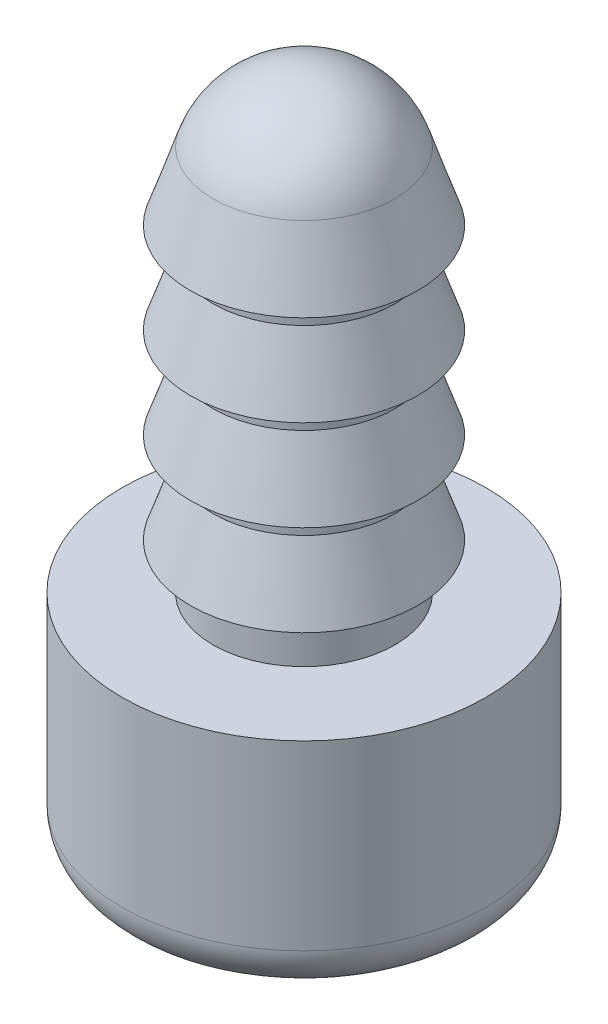
ISO-10303-21;
HEADER;
FILE_DESCRIPTION(('STEP AP214'),'2;1');
FILE_NAME('part.step','',(''),(''),'','','');
FILE_SCHEMA(('AUTOMOTIVE_DESIGN { 1 0 10303 214 1 1 1 1 }'));
ENDSEC;
DATA;
#1=APPLICATION_CONTEXT('core data for automotive mechanical design processes');
#2=APPLICATION_PROTOCOL_DEFINITION('international standard','automotive_design',2000,#1);
#3=PRODUCT_CONTEXT('',#1,'mechanical');
#4=PRODUCT('Part','Part','',(#3));
#5=PRODUCT_RELATED_PRODUCT_CATEGORY('part','',(#4));
#6=PRODUCT_DEFINITION_FORMATION('','',#4);
#7=PRODUCT_DEFINITION_CONTEXT('part definition',#1,'design');
#8=PRODUCT_DEFINITION('design','',#6,#7);
#9=PRODUCT_DEFINITION_SHAPE('','',#8);
#10=(LENGTH_UNIT() NAMED_UNIT(*) SI_UNIT(.MILLI.,.METRE.));
#11=(NAMED_UNIT(*) PLANE_ANGLE_UNIT() SI_UNIT($,.RADIAN.));
#12=(NAMED_UNIT(*) SI_UNIT($,.STERADIAN.) SOLID_ANGLE_UNIT());
#13=UNCERTAINTY_MEASURE_WITH_UNIT(LENGTH_MEASURE(1.E-05),#10,'distance_accuracy_value','');
#14=(GEOMETRIC_REPRESENTATION_CONTEXT(3) GLOBAL_UNCERTAINTY_ASSIGNED_CONTEXT((#13)) GLOBAL_UNIT_ASSIGNED_CONTEXT((#10,
#11,#12)) REPRESENTATION_CONTEXT('',''));
#15=CARTESIAN_POINT('',(0.,0.,0.));
#16=DIRECTION('',(0.,0.,1.));
#17=DIRECTION('',(1.,0.,0.));
#18=AXIS2_PLACEMENT_3D('',#15,#16,#17);
#19=CARTESIAN_POINT('',(0.,-3.21637021355784,0.));
#20=DIRECTION('',(0.,1.,0.));
#21=DIRECTION('',(1.,0.,0.));
#22=AXIS2_PLACEMENT_3D('',#19,#20,#21);
#23=SPHERICAL_SURFACE('',#22,4.21637021355784);
#24=CARTESIAN_POINT('',(0.,-1.88303688022451,0.));
#25=DIRECTION('',(0.,1.,0.));
#26=DIRECTION('',(0.,0.,1.));
#27=AXIS2_PLACEMENT_3D('',#24,#25,#26);
#28=CIRCLE('',#27,4.);
#29=CARTESIAN_POINT('',(0.,-1.88303688022451,4.));
#30=VERTEX_POINT('',#29);
#31=EDGE_CURVE('E111',#30,#30,#28,.T.);
#32=ORIENTED_EDGE('',*,*,#31,.T.);
#33=EDGE_LOOP('',(#32));
#34=FACE_BOUND('',#33,.T.);
#35=ADVANCED_FACE('F43',(#34),#23,.T.);
#36=CARTESIAN_POINT('',(8.00000000000001,-28.8830368802245,0.));
#37=DIRECTION('',(0.,1.,0.));
#38=DIRECTION('',(0.,0.,1.));
#39=AXIS2_PLACEMENT_3D('',#36,#37,#38);
#40=PLANE('',#39);
#41=CARTESIAN_POINT('',(0.,-28.8830368802245,0.));
#42=DIRECTION('',(0.,1.,0.));
#43=DIRECTION('',(0.,0.,1.));
#44=AXIS2_PLACEMENT_3D('',#41,#42,#43);
#45=CIRCLE('',#44,6.);
#46=CARTESIAN_POINT('',(0.,-28.8830368802245,6.));
#47=VERTEX_POINT('',#46);
#48=EDGE_CURVE('E10',#47,#47,#45,.F.);
#49=ORIENTED_EDGE('',*,*,#48,.T.);
#50=EDGE_LOOP('',(#49));
#51=FACE_BOUND('',#50,.T.);
#52=ADVANCED_FACE('F197',(#51),#40,.F.);
#53=CARTESIAN_POINT('',(0.,13.4074248583176,0.));
#54=DIRECTION('',(0.,1.,0.));
#55=DIRECTION('',(0.,0.,1.));
#56=AXIS2_PLACEMENT_3D('',#53,#54,#55);
#57=CYLINDRICAL_SURFACE('',#56,8.);
#58=CARTESIAN_POINT('',(0.,-26.8830368802245,0.));
#59=DIRECTION('',(0.,1.,0.));
#60=DIRECTION('',(0.,0.,1.));
#61=AXIS2_PLACEMENT_3D('',#58,#59,#60);
#62=CIRCLE('',#61,8.);
#63=CARTESIAN_POINT('',(0.,-26.8830368802245,8.));
#64=VERTEX_POINT('',#63);
#65=EDGE_CURVE('E51',#64,#64,#62,.T.);
#66=ORIENTED_EDGE('',*,*,#65,.T.);
#67=EDGE_LOOP('',(#66));
#68=FACE_BOUND('',#67,.T.);
#69=CARTESIAN_POINT('',(0.,-18.8830368802245,0.));
#70=DIRECTION('',(0.,1.,0.));
#71=DIRECTION('',(0.,0.,1.));
#72=AXIS2_PLACEMENT_3D('',#69,#70,#71);
#73=CIRCLE('',#72,8.);
#74=CARTESIAN_POINT('',(0.,-18.8830368802245,8.));
#75=VERTEX_POINT('',#74);
#76=EDGE_CURVE('E56',#75,#75,#73,.T.);
#77=ORIENTED_EDGE('',*,*,#76,.F.);
#78=EDGE_LOOP('',(#77));
#79=FACE_BOUND('',#78,.T.);
#80=ADVANCED_FACE('F192',(#68,#79),#57,.T.);
#81=CARTESIAN_POINT('',(4.,-18.8830368802246,0.));
#82=DIRECTION('',(0.,-1.,0.));
#83=DIRECTION('',(0.,0.,-1.));
#84=AXIS2_PLACEMENT_3D('',#81,#82,#83);
#85=PLANE('',#84);
#86=CARTESIAN_POINT('',(0.,-18.8830368802246,0.));
#87=DIRECTION('',(0.,1.,0.));
#88=DIRECTION('',(0.,0.,1.));
#89=AXIS2_PLACEMENT_3D('',#86,#87,#88);
#90=CIRCLE('',#89,4.);
#91=CARTESIAN_POINT('',(0.,-18.8830368802246,4.));
#92=VERTEX_POINT('',#91);
#93=EDGE_CURVE('E61',#92,#92,#90,.T.);
#94=ORIENTED_EDGE('',*,*,#93,.F.);
#95=EDGE_LOOP('',(#94));
#96=FACE_BOUND('',#95,.T.);
#97=ORIENTED_EDGE('',*,*,#76,.T.);
#98=EDGE_LOOP('',(#97));
#99=FACE_BOUND('',#98,.T.);
#100=ADVANCED_FACE('F186',(#96,#99),#85,.F.);
#101=CARTESIAN_POINT('',(0.,13.4074248583176,0.));
#102=DIRECTION('',(0.,1.,0.));
#103=DIRECTION('',(0.,0.,1.));
#104=AXIS2_PLACEMENT_3D('',#101,#102,#103);
#105=CYLINDRICAL_SURFACE('',#104,4.);
#106=CARTESIAN_POINT('',(0.,-15.8830368802245,0.));
#107=DIRECTION('',(0.,1.,0.));
#108=DIRECTION('',(0.,0.,1.));
#109=AXIS2_PLACEMENT_3D('',#106,#107,#108);
#110=CIRCLE('',#109,4.);
#111=CARTESIAN_POINT('',(0.,-15.8830368802245,4.));
#112=VERTEX_POINT('',#111);
#113=EDGE_CURVE('E67',#112,#112,#110,.T.);
#114=ORIENTED_EDGE('',*,*,#113,.F.);
#115=EDGE_LOOP('',(#114));
#116=FACE_BOUND('',#115,.T.);
#117=ORIENTED_EDGE('',*,*,#93,.T.);
#118=EDGE_LOOP('',(#117));
#119=FACE_BOUND('',#118,.T.);
#120=ADVANCED_FACE('F180',(#116,#119),#105,.T.);
#121=CARTESIAN_POINT('',(0.,-15.8830368802245,0.));
#122=DIRECTION('',(0.,-1.,0.));
#123=DIRECTION('',(0.,0.,-1.));
#124=AXIS2_PLACEMENT_3D('',#121,#122,#123);
#125=CONICAL_SURFACE('',#124,4.,0.785398163397443);
#126=CARTESIAN_POINT('',(0.,-16.8830368802246,0.));
#127=DIRECTION('',(0.,1.,0.));
#128=DIRECTION('',(0.,0.,1.));
#129=AXIS2_PLACEMENT_3D('',#126,#127,#128);
#130=CIRCLE('',#129,5.);
#131=CARTESIAN_POINT('',(0.,-16.8830368802246,5.));
#132=VERTEX_POINT('',#131);
#133=EDGE_CURVE('E71',#132,#132,#130,.T.);
#134=ORIENTED_EDGE('',*,*,#133,.F.);
#135=EDGE_LOOP('',(#134));
#136=FACE_BOUND('',#135,.T.);
#137=ORIENTED_EDGE('',*,*,#113,.T.);
#138=EDGE_LOOP('',(#137));
#139=FACE_BOUND('',#138,.T.);
#140=ADVANCED_FACE('F174',(#136,#139),#125,.F.);
#141=CARTESIAN_POINT('',(0.,-16.8830368802246,0.));
#142=DIRECTION('',(0.,-1.,0.));
#143=DIRECTION('',(0.,0.,-1.));
#144=AXIS2_PLACEMENT_3D('',#141,#142,#143);
#145=CONICAL_SURFACE('',#144,5.,0.321750554396641);
#146=CARTESIAN_POINT('',(0.,-13.8830368802245,0.));
#147=DIRECTION('',(0.,1.,0.));
#148=DIRECTION('',(0.,0.,1.));
#149=AXIS2_PLACEMENT_3D('',#146,#147,#148);
#150=CIRCLE('',#149,4.);
#151=CARTESIAN_POINT('',(0.,-13.8830368802245,4.));
#152=VERTEX_POINT('',#151);
#153=EDGE_CURVE('E75',#152,#152,#150,.T.);
#154=ORIENTED_EDGE('',*,*,#153,.F.);
#155=EDGE_LOOP('',(#154));
#156=FACE_BOUND('',#155,.T.);
#157=ORIENTED_EDGE('',*,*,#133,.T.);
#158=EDGE_LOOP('',(#157));
#159=FACE_BOUND('',#158,.T.);
#160=ADVANCED_FACE('F168',(#156,#159),#145,.T.);
#161=CARTESIAN_POINT('',(0.,13.4074248583176,0.));
#162=DIRECTION('',(0.,1.,0.));
#163=DIRECTION('',(0.,0.,1.));
#164=AXIS2_PLACEMENT_3D('',#161,#162,#163);
#165=CYLINDRICAL_SURFACE('',#164,4.);
#166=CARTESIAN_POINT('',(0.,-11.8830368802245,0.));
#167=DIRECTION('',(0.,1.,0.));
#168=DIRECTION('',(0.,0.,1.));
#169=AXIS2_PLACEMENT_3D('',#166,#167,#168);
#170=CIRCLE('',#169,4.);
#171=CARTESIAN_POINT('',(0.,-11.8830368802245,4.));
#172=VERTEX_POINT('',#171);
#173=EDGE_CURVE('E79',#172,#172,#170,.T.);
#174=ORIENTED_EDGE('',*,*,#173,.F.);
#175=EDGE_LOOP('',(#174));
#176=FACE_BOUND('',#175,.T.);
#177=ORIENTED_EDGE('',*,*,#153,.T.);
#178=EDGE_LOOP('',(#177));
#179=FACE_BOUND('',#178,.T.);
#180=ADVANCED_FACE('F162',(#176,#179),#165,.T.);
#181=CARTESIAN_POINT('',(0.,-11.8830368802245,0.));
#182=DIRECTION('',(0.,-1.,0.));
#183=DIRECTION('',(0.,0.,-1.));
#184=AXIS2_PLACEMENT_3D('',#181,#182,#183);
#185=CONICAL_SURFACE('',#184,4.,0.785398163397445);
#186=CARTESIAN_POINT('',(0.,-12.8830368802245,0.));
#187=DIRECTION('',(0.,1.,0.));
#188=DIRECTION('',(0.,0.,1.));
#189=AXIS2_PLACEMENT_3D('',#186,#187,#188);
#190=CIRCLE('',#189,5.);
#191=CARTESIAN_POINT('',(0.,-12.8830368802245,5.));
#192=VERTEX_POINT('',#191);
#193=EDGE_CURVE('E83',#192,#192,#190,.T.);
#194=ORIENTED_EDGE('',*,*,#193,.F.);
#195=EDGE_LOOP('',(#194));
#196=FACE_BOUND('',#195,.T.);
#197=ORIENTED_EDGE('',*,*,#173,.T.);
#198=EDGE_LOOP('',(#197));
#199=FACE_BOUND('',#198,.T.);
#200=ADVANCED_FACE('F156',(#196,#199),#185,.F.);
#201=CARTESIAN_POINT('',(0.,-12.8830368802245,0.));
#202=DIRECTION('',(0.,-1.,0.));
#203=DIRECTION('',(0.,0.,-1.));
#204=AXIS2_PLACEMENT_3D('',#201,#202,#203);
#205=CONICAL_SURFACE('',#204,5.,0.321750554396641);
#206=CARTESIAN_POINT('',(0.,-9.88303688022453,0.));
#207=DIRECTION('',(0.,1.,0.));
#208=DIRECTION('',(0.,0.,1.));
#209=AXIS2_PLACEMENT_3D('',#206,#207,#208);
#210=CIRCLE('',#209,4.);
#211=CARTESIAN_POINT('',(0.,-9.88303688022453,4.));
#212=VERTEX_POINT('',#211);
#213=EDGE_CURVE('E87',#212,#212,#210,.T.);
#214=ORIENTED_EDGE('',*,*,#213,.F.);
#215=EDGE_LOOP('',(#214));
#216=FACE_BOUND('',#215,.T.);
#217=ORIENTED_EDGE('',*,*,#193,.T.);
#218=EDGE_LOOP('',(#217));
#219=FACE_BOUND('',#218,.T.);
#220=ADVANCED_FACE('F150',(#216,#219),#205,.T.);
#221=CARTESIAN_POINT('',(0.,13.4074248583176,0.));
#222=DIRECTION('',(0.,1.,0.));
#223=DIRECTION('',(0.,0.,1.));
#224=AXIS2_PLACEMENT_3D('',#221,#222,#223);
#225=CYLINDRICAL_SURFACE('',#224,4.);
#226=CARTESIAN_POINT('',(0.,-7.88303688022452,0.));
#227=DIRECTION('',(0.,1.,0.));
#228=DIRECTION('',(0.,0.,1.));
#229=AXIS2_PLACEMENT_3D('',#226,#227,#228);
#230=CIRCLE('',#229,4.);
#231=CARTESIAN_POINT('',(0.,-7.88303688022452,4.));
#232=VERTEX_POINT('',#231);
#233=EDGE_CURVE('E91',#232,#232,#230,.T.);
#234=ORIENTED_EDGE('',*,*,#233,.F.);
#235=EDGE_LOOP('',(#234));
#236=FACE_BOUND('',#235,.T.);
#237=ORIENTED_EDGE('',*,*,#213,.T.);
#238=EDGE_LOOP('',(#237));
#239=FACE_BOUND('',#238,.T.);
#240=ADVANCED_FACE('F144',(#236,#239),#225,.T.);
#241=CARTESIAN_POINT('',(0.,-7.88303688022452,0.));
#242=DIRECTION('',(0.,-1.,0.));
#243=DIRECTION('',(0.,0.,-1.));
#244=AXIS2_PLACEMENT_3D('',#241,#242,#243);
#245=CONICAL_SURFACE('',#244,4.,0.785398163397442);
#246=CARTESIAN_POINT('',(0.,-8.88303688022453,0.));
#247=DIRECTION('',(0.,1.,0.));
#248=DIRECTION('',(0.,0.,1.));
#249=AXIS2_PLACEMENT_3D('',#246,#247,#248);
#250=CIRCLE('',#249,5.);
#251=CARTESIAN_POINT('',(0.,-8.88303688022453,5.));
#252=VERTEX_POINT('',#251);
#253=EDGE_CURVE('E95',#252,#252,#250,.T.);
#254=ORIENTED_EDGE('',*,*,#253,.F.);
#255=EDGE_LOOP('',(#254));
#256=FACE_BOUND('',#255,.T.);
#257=ORIENTED_EDGE('',*,*,#233,.T.);
#258=EDGE_LOOP('',(#257));
#259=FACE_BOUND('',#258,.T.);
#260=ADVANCED_FACE('F138',(#256,#259),#245,.F.);
#261=CARTESIAN_POINT('',(0.,-8.88303688022453,0.));
#262=DIRECTION('',(0.,-1.,0.));
#263=DIRECTION('',(0.,0.,-1.));
#264=AXIS2_PLACEMENT_3D('',#261,#262,#263);
#265=CONICAL_SURFACE('',#264,5.,0.321750554396641);
#266=CARTESIAN_POINT('',(0.,-5.88303688022452,0.));
#267=DIRECTION('',(0.,1.,0.));
#268=DIRECTION('',(0.,0.,1.));
#269=AXIS2_PLACEMENT_3D('',#266,#267,#268);
#270=CIRCLE('',#269,4.);
#271=CARTESIAN_POINT('',(0.,-5.88303688022452,4.));
#272=VERTEX_POINT('',#271);
#273=EDGE_CURVE('E99',#272,#272,#270,.T.);
#274=ORIENTED_EDGE('',*,*,#273,.F.);
#275=EDGE_LOOP('',(#274));
#276=FACE_BOUND('',#275,.T.);
#277=ORIENTED_EDGE('',*,*,#253,.T.);
#278=EDGE_LOOP('',(#277));
#279=FACE_BOUND('',#278,.T.);
#280=ADVANCED_FACE('F132',(#276,#279),#265,.T.);
#281=CARTESIAN_POINT('',(0.,13.4074248583176,0.));
#282=DIRECTION('',(0.,1.,0.));
#283=DIRECTION('',(0.,0.,1.));
#284=AXIS2_PLACEMENT_3D('',#281,#282,#283);
#285=CYLINDRICAL_SURFACE('',#284,4.);
#286=CARTESIAN_POINT('',(0.,-3.88303688022451,0.));
#287=DIRECTION('',(0.,1.,0.));
#288=DIRECTION('',(0.,0.,1.));
#289=AXIS2_PLACEMENT_3D('',#286,#287,#288);
#290=CIRCLE('',#289,4.);
#291=CARTESIAN_POINT('',(0.,-3.88303688022451,4.));
#292=VERTEX_POINT('',#291);
#293=EDGE_CURVE('E103',#292,#292,#290,.T.);
#294=ORIENTED_EDGE('',*,*,#293,.F.);
#295=EDGE_LOOP('',(#294));
#296=FACE_BOUND('',#295,.T.);
#297=ORIENTED_EDGE('',*,*,#273,.T.);
#298=EDGE_LOOP('',(#297));
#299=FACE_BOUND('',#298,.T.);
#300=ADVANCED_FACE('F126',(#296,#299),#285,.T.);
#301=CARTESIAN_POINT('',(0.,-3.88303688022451,0.));
#302=DIRECTION('',(0.,-1.,0.));
#303=DIRECTION('',(0.,0.,-1.));
#304=AXIS2_PLACEMENT_3D('',#301,#302,#303);
#305=CONICAL_SURFACE('',#304,4.,0.785398163397443);
#306=CARTESIAN_POINT('',(0.,-4.88303688022452,0.));
#307=DIRECTION('',(0.,1.,0.));
#308=DIRECTION('',(0.,0.,1.));
#309=AXIS2_PLACEMENT_3D('',#306,#307,#308);
#310=CIRCLE('',#309,5.);
#311=CARTESIAN_POINT('',(0.,-4.88303688022452,5.));
#312=VERTEX_POINT('',#311);
#313=EDGE_CURVE('E107',#312,#312,#310,.T.);
#314=ORIENTED_EDGE('',*,*,#313,.F.);
#315=EDGE_LOOP('',(#314));
#316=FACE_BOUND('',#315,.T.);
#317=ORIENTED_EDGE('',*,*,#293,.T.);
#318=EDGE_LOOP('',(#317));
#319=FACE_BOUND('',#318,.T.);
#320=ADVANCED_FACE('F120',(#316,#319),#305,.F.);
#321=CARTESIAN_POINT('',(0.,-4.88303688022452,0.));
#322=DIRECTION('',(0.,-1.,0.));
#323=DIRECTION('',(0.,0.,-1.));
#324=AXIS2_PLACEMENT_3D('',#321,#322,#323);
#325=CONICAL_SURFACE('',#324,5.,0.321750554396641);
#326=ORIENTED_EDGE('',*,*,#31,.F.);
#327=EDGE_LOOP('',(#326));
#328=FACE_BOUND('',#327,.T.);
#329=ORIENTED_EDGE('',*,*,#313,.T.);
#330=EDGE_LOOP('',(#329));
#331=FACE_BOUND('',#330,.T.);
#332=ADVANCED_FACE('F117',(#328,#331),#325,.T.);
#333=CARTESIAN_POINT('',(0.,-26.8830368802245,0.));
#334=DIRECTION('',(0.,1.,0.));
#335=DIRECTION('',(0.,0.,1.));
#336=AXIS2_PLACEMENT_3D('',#333,#334,#335);
#337=TOROIDAL_SURFACE('',#336,6.,2.);
#338=ORIENTED_EDGE('',*,*,#48,.F.);
#339=EDGE_LOOP('',(#338));
#340=FACE_BOUND('',#339,.T.);
#341=ORIENTED_EDGE('',*,*,#65,.F.);
#342=EDGE_LOOP('',(#341));
#343=FACE_BOUND('',#342,.T.);
#344=ADVANCED_FACE('F45',(#340,#343),#337,.T.);
#345=CLOSED_SHELL('',(#35,#52,#80,#100,#120,#140,#160,#180,#200,#220,#240,#260,#280,#300,#320,
#332,#344));
#346=MANIFOLD_SOLID_BREP('B2',#345);
#347=ADVANCED_BREP_SHAPE_REPRESENTATION('',(#18,#346),#14);
#348=SHAPE_DEFINITION_REPRESENTATION(#9,#347);
ENDSEC;
END-ISO-10303-21;
